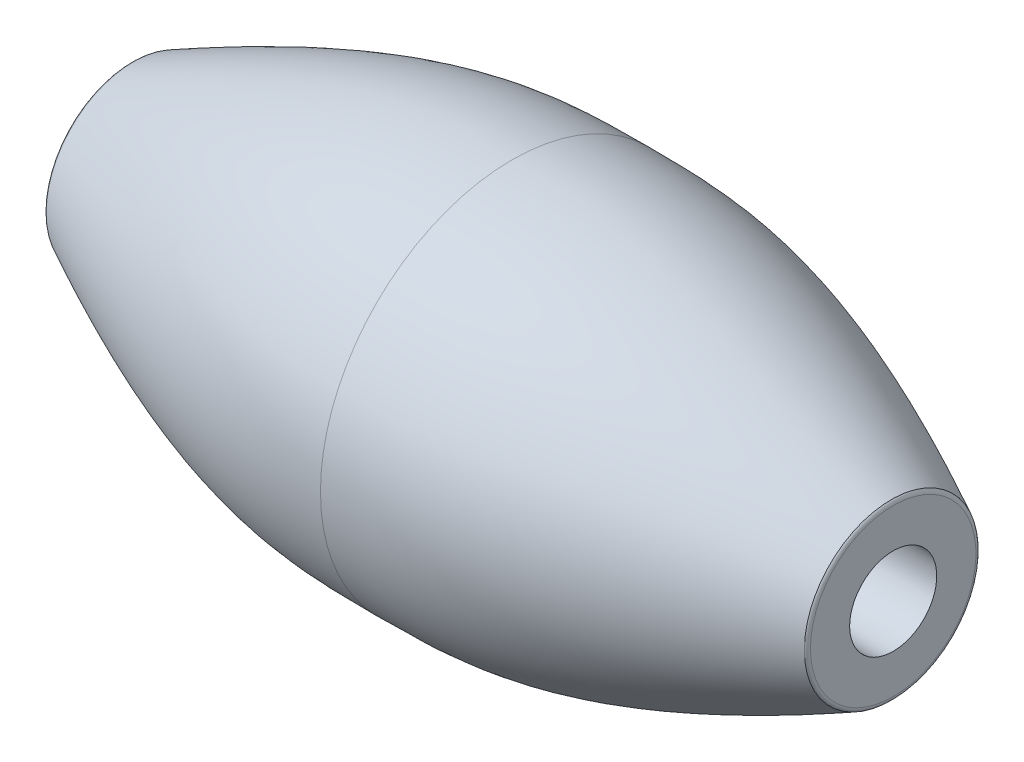
ISO-10303-21;
HEADER;
FILE_DESCRIPTION(('STEP AP214'),'2;1');
FILE_NAME('part.step','',(''),(''),'','','');
FILE_SCHEMA(('AUTOMOTIVE_DESIGN { 1 0 10303 214 1 1 1 1 }'));
ENDSEC;
DATA;
#1=APPLICATION_CONTEXT('core data for automotive mechanical design processes');
#2=APPLICATION_PROTOCOL_DEFINITION('international standard','automotive_design',2000,#1);
#3=PRODUCT_CONTEXT('',#1,'mechanical');
#4=PRODUCT('Part','Part','',(#3));
#5=PRODUCT_RELATED_PRODUCT_CATEGORY('part','',(#4));
#6=PRODUCT_DEFINITION_FORMATION('','',#4);
#7=PRODUCT_DEFINITION_CONTEXT('part definition',#1,'design');
#8=PRODUCT_DEFINITION('design','',#6,#7);
#9=PRODUCT_DEFINITION_SHAPE('','',#8);
#10=(LENGTH_UNIT() NAMED_UNIT(*) SI_UNIT(.MILLI.,.METRE.));
#11=(NAMED_UNIT(*) PLANE_ANGLE_UNIT() SI_UNIT($,.RADIAN.));
#12=(NAMED_UNIT(*) SI_UNIT($,.STERADIAN.) SOLID_ANGLE_UNIT());
#13=UNCERTAINTY_MEASURE_WITH_UNIT(LENGTH_MEASURE(1.E-05),#10,'distance_accuracy_value','');
#14=(GEOMETRIC_REPRESENTATION_CONTEXT(3) GLOBAL_UNCERTAINTY_ASSIGNED_CONTEXT((#13)) GLOBAL_UNIT_ASSIGNED_CONTEXT((#10,
#11,#12)) REPRESENTATION_CONTEXT('',''));
#15=CARTESIAN_POINT('',(0.,0.,0.));
#16=DIRECTION('',(0.,0.,1.));
#17=DIRECTION('',(1.,0.,0.));
#18=AXIS2_PLACEMENT_3D('',#15,#16,#17);
#19=CARTESIAN_POINT('',(0.,0.,-6.8));
#20=CARTESIAN_POINT('',(4.,0.,-6.8));
#21=CARTESIAN_POINT('',(8.,0.,-6.8));
#22=CARTESIAN_POINT('',(17.4106985313503,0.,-1.99150974393446));
#23=B_SPLINE_CURVE_WITH_KNOTS('',3,(#19,#20,#21,#22),.UNSPECIFIED.,.F.,.F.,(4,4),(0.,1.),.UNSPECIFIED.);
#24=CARTESIAN_POINT('',(-8.,0.,2.));
#25=DIRECTION('',(-1.,0.,0.));
#26=AXIS1_PLACEMENT('',#24,#25);
#27=SURFACE_OF_REVOLUTION('',#23,#26);
#28=CARTESIAN_POINT('',(17.4106985313503,0.,2.));
#29=DIRECTION('',(-1.,0.,0.));
#30=DIRECTION('',(0.,0.,1.));
#31=AXIS2_PLACEMENT_3D('',#28,#29,#30);
#32=CIRCLE('',#31,3.99150974393446);
#33=CARTESIAN_POINT('',(17.4106985313503,0.,5.99150974393446));
#34=VERTEX_POINT('',#33);
#35=EDGE_CURVE('E60',#34,#34,#32,.T.);
#36=ORIENTED_EDGE('',*,*,#35,.T.);
#37=EDGE_LOOP('',(#36));
#38=FACE_BOUND('',#37,.T.);
#39=CARTESIAN_POINT('',(0.,0.,2.));
#40=DIRECTION('',(-1.,0.,0.));
#41=DIRECTION('',(0.,0.,1.));
#42=AXIS2_PLACEMENT_3D('',#39,#40,#41);
#43=CIRCLE('',#42,8.8);
#44=CARTESIAN_POINT('',(0.,0.,10.8));
#45=VERTEX_POINT('',#44);
#46=EDGE_CURVE('E10',#45,#45,#43,.T.);
#47=ORIENTED_EDGE('',*,*,#46,.F.);
#48=EDGE_LOOP('',(#47));
#49=FACE_BOUND('',#48,.T.);
#50=ADVANCED_FACE('F34',(#38,#49),#27,.F.);
#51=CARTESIAN_POINT('',(0.,0.,-6.8));
#52=CARTESIAN_POINT('',(-4.,0.,-6.8));
#53=CARTESIAN_POINT('',(-8.,0.,-6.8));
#54=CARTESIAN_POINT('',(-17.3768179309917,0.,-2.01544654181252));
#55=B_SPLINE_CURVE_WITH_KNOTS('',3,(#51,#52,#53,#54),.UNSPECIFIED.,.F.,.F.,(4,4),(0.,1.),.UNSPECIFIED.);
#56=CARTESIAN_POINT('',(-8.,0.,2.));
#57=DIRECTION('',(-1.,0.,0.));
#58=AXIS1_PLACEMENT('',#56,#57);
#59=SURFACE_OF_REVOLUTION('',#55,#58);
#60=CARTESIAN_POINT('',(-17.3768179309917,0.,2.));
#61=DIRECTION('',(-1.,0.,0.));
#62=DIRECTION('',(0.,0.,1.));
#63=AXIS2_PLACEMENT_3D('',#60,#61,#62);
#64=CIRCLE('',#63,4.01544654181252);
#65=CARTESIAN_POINT('',(-17.3768179309917,0.,6.01544654181252));
#66=VERTEX_POINT('',#65);
#67=EDGE_CURVE('E41',#66,#66,#64,.T.);
#68=ORIENTED_EDGE('',*,*,#67,.F.);
#69=EDGE_LOOP('',(#68));
#70=FACE_BOUND('',#69,.T.);
#71=ORIENTED_EDGE('',*,*,#46,.T.);
#72=EDGE_LOOP('',(#71));
#73=FACE_BOUND('',#72,.T.);
#74=ADVANCED_FACE('F72',(#70,#73),#59,.T.);
#75=CARTESIAN_POINT('',(-17.25,0.,2.));
#76=DIRECTION('',(-1.,0.,0.));
#77=DIRECTION('',(0.,0.,1.));
#78=AXIS2_PLACEMENT_3D('',#75,#76,#77);
#79=TOROIDAL_SURFACE('',#78,3.8,0.25);
#80=ORIENTED_EDGE('',*,*,#67,.T.);
#81=EDGE_LOOP('',(#80));
#82=FACE_BOUND('',#81,.T.);
#83=CARTESIAN_POINT('',(-17.5,0.,2.));
#84=DIRECTION('',(-1.,0.,0.));
#85=DIRECTION('',(0.,0.,1.));
#86=AXIS2_PLACEMENT_3D('',#83,#84,#85);
#87=CIRCLE('',#86,3.8);
#88=CARTESIAN_POINT('',(-17.5,0.,5.8));
#89=VERTEX_POINT('',#88);
#90=EDGE_CURVE('E45',#89,#89,#87,.T.);
#91=ORIENTED_EDGE('',*,*,#90,.F.);
#92=EDGE_LOOP('',(#91));
#93=FACE_BOUND('',#92,.T.);
#94=ADVANCED_FACE('F75',(#82,#93),#79,.T.);
#95=CARTESIAN_POINT('',(-17.5,0.,0.));
#96=DIRECTION('',(1.,0.,0.));
#97=DIRECTION('',(0.,0.,-1.));
#98=AXIS2_PLACEMENT_3D('',#95,#96,#97);
#99=PLANE('',#98);
#100=CARTESIAN_POINT('',(-17.5,0.,2.));
#101=DIRECTION('',(-1.,0.,0.));
#102=DIRECTION('',(0.,0.,1.));
#103=AXIS2_PLACEMENT_3D('',#100,#101,#102);
#104=CIRCLE('',#103,2.);
#105=CARTESIAN_POINT('',(-17.5,0.,4.));
#106=VERTEX_POINT('',#105);
#107=EDGE_CURVE('E49',#106,#106,#104,.T.);
#108=ORIENTED_EDGE('',*,*,#107,.F.);
#109=EDGE_LOOP('',(#108));
#110=FACE_BOUND('',#109,.T.);
#111=ORIENTED_EDGE('',*,*,#90,.T.);
#112=EDGE_LOOP('',(#111));
#113=FACE_BOUND('',#112,.T.);
#114=ADVANCED_FACE('F79',(#110,#113),#99,.F.);
#115=CARTESIAN_POINT('',(-8.,0.,2.));
#116=DIRECTION('',(-1.,0.,0.));
#117=DIRECTION('',(0.,0.,1.));
#118=AXIS2_PLACEMENT_3D('',#115,#116,#117);
#119=CYLINDRICAL_SURFACE('',#118,2.);
#120=ORIENTED_EDGE('',*,*,#107,.T.);
#121=EDGE_LOOP('',(#120));
#122=FACE_BOUND('',#121,.T.);
#123=CARTESIAN_POINT('',(17.5,0.,2.));
#124=DIRECTION('',(-1.,0.,0.));
#125=DIRECTION('',(0.,0.,1.));
#126=AXIS2_PLACEMENT_3D('',#123,#124,#125);
#127=CIRCLE('',#126,2.);
#128=CARTESIAN_POINT('',(17.5,0.,4.));
#129=VERTEX_POINT('',#128);
#130=EDGE_CURVE('E54',#129,#129,#127,.T.);
#131=ORIENTED_EDGE('',*,*,#130,.F.);
#132=EDGE_LOOP('',(#131));
#133=FACE_BOUND('',#132,.T.);
#134=ADVANCED_FACE('F82',(#122,#133),#119,.F.);
#135=CARTESIAN_POINT('',(17.5,0.,0.));
#136=DIRECTION('',(1.,0.,0.));
#137=DIRECTION('',(0.,0.,-1.));
#138=AXIS2_PLACEMENT_3D('',#135,#136,#137);
#139=PLANE('',#138);
#140=ORIENTED_EDGE('',*,*,#130,.T.);
#141=EDGE_LOOP('',(#140));
#142=FACE_BOUND('',#141,.T.);
#143=CARTESIAN_POINT('',(17.5,0.,2.));
#144=DIRECTION('',(-1.,0.,0.));
#145=DIRECTION('',(0.,0.,1.));
#146=AXIS2_PLACEMENT_3D('',#143,#144,#145);
#147=CIRCLE('',#146,3.8);
#148=CARTESIAN_POINT('',(17.5,0.,5.8));
#149=VERTEX_POINT('',#148);
#150=EDGE_CURVE('E57',#149,#149,#147,.T.);
#151=ORIENTED_EDGE('',*,*,#150,.F.);
#152=EDGE_LOOP('',(#151));
#153=FACE_BOUND('',#152,.T.);
#154=ADVANCED_FACE('F86',(#142,#153),#139,.T.);
#155=CARTESIAN_POINT('',(17.25,0.,2.));
#156=DIRECTION('',(-1.,0.,0.));
#157=DIRECTION('',(0.,0.,1.));
#158=AXIS2_PLACEMENT_3D('',#155,#156,#157);
#159=TOROIDAL_SURFACE('',#158,3.8,0.25);
#160=ORIENTED_EDGE('',*,*,#35,.F.);
#161=EDGE_LOOP('',(#160));
#162=FACE_BOUND('',#161,.T.);
#163=ORIENTED_EDGE('',*,*,#150,.T.);
#164=EDGE_LOOP('',(#163));
#165=FACE_BOUND('',#164,.T.);
#166=ADVANCED_FACE('F90',(#162,#165),#159,.T.);
#167=CLOSED_SHELL('',(#50,#74,#94,#114,#134,#154,#166));
#168=MANIFOLD_SOLID_BREP('B2',#167);
#169=ADVANCED_BREP_SHAPE_REPRESENTATION('',(#18,#168),#14);
#170=SHAPE_DEFINITION_REPRESENTATION(#9,#169);
ENDSEC;
END-ISO-10303-21;
